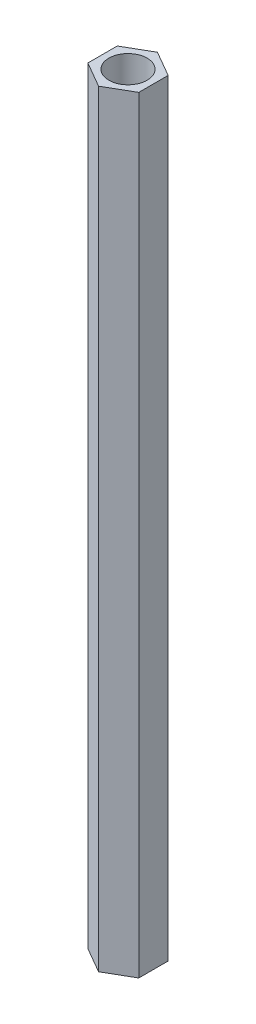
ISO-10303-21;
HEADER;
FILE_DESCRIPTION(('STEP AP214'),'2;1');
FILE_NAME('part.step','',(''),(''),'','','');
FILE_SCHEMA(('AUTOMOTIVE_DESIGN { 1 0 10303 214 1 1 1 1 }'));
ENDSEC;
DATA;
#1=APPLICATION_CONTEXT('core data for automotive mechanical design processes');
#2=APPLICATION_PROTOCOL_DEFINITION('international standard','automotive_design',2000,#1);
#3=PRODUCT_CONTEXT('',#1,'mechanical');
#4=PRODUCT('Part','Part','',(#3));
#5=PRODUCT_RELATED_PRODUCT_CATEGORY('part','',(#4));
#6=PRODUCT_DEFINITION_FORMATION('','',#4);
#7=PRODUCT_DEFINITION_CONTEXT('part definition',#1,'design');
#8=PRODUCT_DEFINITION('design','',#6,#7);
#9=PRODUCT_DEFINITION_SHAPE('','',#8);
#10=(LENGTH_UNIT() NAMED_UNIT(*) SI_UNIT(.MILLI.,.METRE.));
#11=(NAMED_UNIT(*) PLANE_ANGLE_UNIT() SI_UNIT($,.RADIAN.));
#12=(NAMED_UNIT(*) SI_UNIT($,.STERADIAN.) SOLID_ANGLE_UNIT());
#13=UNCERTAINTY_MEASURE_WITH_UNIT(LENGTH_MEASURE(1.E-05),#10,'distance_accuracy_value','');
#14=(GEOMETRIC_REPRESENTATION_CONTEXT(3) GLOBAL_UNCERTAINTY_ASSIGNED_CONTEXT((#13)) GLOBAL_UNIT_ASSIGNED_CONTEXT((#10,
#11,#12)) REPRESENTATION_CONTEXT('',''));
#15=CARTESIAN_POINT('',(0.,0.,0.));
#16=DIRECTION('',(0.,0.,1.));
#17=DIRECTION('',(1.,0.,0.));
#18=AXIS2_PLACEMENT_3D('',#15,#16,#17);
#19=CARTESIAN_POINT('',(0.,60.,0.));
#20=DIRECTION('',(0.,1.,0.));
#21=DIRECTION('',(0.,0.,1.));
#22=AXIS2_PLACEMENT_3D('',#19,#20,#21);
#23=PLANE('',#22);
#24=DIRECTION('',(-0.866025403784439,0.,-0.5));
#25=VECTOR('',#24,1.);
#26=CARTESIAN_POINT('',(1.99185842870421,60.,-1.15));
#27=LINE('',#26,#25);
#28=CARTESIAN_POINT('',(1.99185842870421,60.,-1.15));
#29=VERTEX_POINT('',#28);
#30=CARTESIAN_POINT('',(0.,60.,-2.3));
#31=VERTEX_POINT('',#30);
#32=EDGE_CURVE('E137',#29,#31,#27,.T.);
#33=ORIENTED_EDGE('',*,*,#32,.T.);
#34=DIRECTION('',(-0.866025403784439,0.,0.5));
#35=VECTOR('',#34,1.);
#36=CARTESIAN_POINT('',(0.,60.,-2.3));
#37=LINE('',#36,#35);
#38=CARTESIAN_POINT('',(-1.99185842870421,60.,-1.15));
#39=VERTEX_POINT('',#38);
#40=EDGE_CURVE('E95',#31,#39,#37,.T.);
#41=ORIENTED_EDGE('',*,*,#40,.T.);
#42=DIRECTION('',(0.,0.,1.));
#43=VECTOR('',#42,1.);
#44=CARTESIAN_POINT('',(-1.99185842870421,60.,-1.15));
#45=LINE('',#44,#43);
#46=CARTESIAN_POINT('',(-1.99185842870421,60.,1.15));
#47=VERTEX_POINT('',#46);
#48=EDGE_CURVE('E108',#39,#47,#45,.T.);
#49=ORIENTED_EDGE('',*,*,#48,.T.);
#50=DIRECTION('',(0.866025403784439,0.,0.5));
#51=VECTOR('',#50,1.);
#52=CARTESIAN_POINT('',(-1.99185842870421,60.,1.15));
#53=LINE('',#52,#51);
#54=CARTESIAN_POINT('',(0.,60.,2.3));
#55=VERTEX_POINT('',#54);
#56=EDGE_CURVE('E102',#47,#55,#53,.T.);
#57=ORIENTED_EDGE('',*,*,#56,.T.);
#58=DIRECTION('',(0.866025403784439,0.,-0.5));
#59=VECTOR('',#58,1.);
#60=CARTESIAN_POINT('',(0.,60.,2.3));
#61=LINE('',#60,#59);
#62=CARTESIAN_POINT('',(1.99185842870421,60.,1.15));
#63=VERTEX_POINT('',#62);
#64=EDGE_CURVE('E106',#55,#63,#61,.T.);
#65=ORIENTED_EDGE('',*,*,#64,.T.);
#66=DIRECTION('',(0.,0.,-1.));
#67=VECTOR('',#66,1.);
#68=CARTESIAN_POINT('',(1.99185842870421,60.,1.15));
#69=LINE('',#68,#67);
#70=EDGE_CURVE('E58',#63,#29,#69,.T.);
#71=ORIENTED_EDGE('',*,*,#70,.T.);
#72=EDGE_LOOP('',(#33,#41,#49,#57,#65,#71));
#73=FACE_BOUND('',#72,.T.);
#74=CARTESIAN_POINT('',(0.,60.,0.));
#75=DIRECTION('',(0.,1.,0.));
#76=DIRECTION('',(0.,0.,1.));
#77=AXIS2_PLACEMENT_3D('',#74,#75,#76);
#78=CIRCLE('',#77,1.5);
#79=CARTESIAN_POINT('',(0.,60.,1.5));
#80=VERTEX_POINT('',#79);
#81=EDGE_CURVE('E130',#80,#80,#78,.T.);
#82=ORIENTED_EDGE('',*,*,#81,.F.);
#83=EDGE_LOOP('',(#82));
#84=FACE_BOUND('',#83,.T.);
#85=ADVANCED_FACE('F41',(#73,#84),#23,.T.);
#86=CARTESIAN_POINT('',(0.,0.,0.));
#87=DIRECTION('',(0.,1.,0.));
#88=DIRECTION('',(0.,0.,1.));
#89=AXIS2_PLACEMENT_3D('',#86,#87,#88);
#90=PLANE('',#89);
#91=DIRECTION('',(-0.866025403784439,0.,-0.5));
#92=VECTOR('',#91,1.);
#93=CARTESIAN_POINT('',(1.99185842870421,0.,-1.15));
#94=LINE('',#93,#92);
#95=CARTESIAN_POINT('',(1.99185842870421,0.,-1.15));
#96=VERTEX_POINT('',#95);
#97=CARTESIAN_POINT('',(0.,0.,-2.3));
#98=VERTEX_POINT('',#97);
#99=EDGE_CURVE('E126',#96,#98,#94,.T.);
#100=ORIENTED_EDGE('',*,*,#99,.F.);
#101=DIRECTION('',(0.,0.,-1.));
#102=VECTOR('',#101,1.);
#103=CARTESIAN_POINT('',(1.99185842870421,0.,1.15));
#104=LINE('',#103,#102);
#105=CARTESIAN_POINT('',(1.99185842870421,0.,1.15));
#106=VERTEX_POINT('',#105);
#107=EDGE_CURVE('E87',#106,#96,#104,.T.);
#108=ORIENTED_EDGE('',*,*,#107,.F.);
#109=DIRECTION('',(0.866025403784439,0.,-0.5));
#110=VECTOR('',#109,1.);
#111=CARTESIAN_POINT('',(0.,0.,2.3));
#112=LINE('',#111,#110);
#113=CARTESIAN_POINT('',(0.,0.,2.3));
#114=VERTEX_POINT('',#113);
#115=EDGE_CURVE('E81',#114,#106,#112,.T.);
#116=ORIENTED_EDGE('',*,*,#115,.F.);
#117=DIRECTION('',(0.866025403784439,0.,0.5));
#118=VECTOR('',#117,1.);
#119=CARTESIAN_POINT('',(-1.99185842870421,0.,1.15));
#120=LINE('',#119,#118);
#121=CARTESIAN_POINT('',(-1.99185842870421,0.,1.15));
#122=VERTEX_POINT('',#121);
#123=EDGE_CURVE('E116',#122,#114,#120,.T.);
#124=ORIENTED_EDGE('',*,*,#123,.F.);
#125=DIRECTION('',(0.,0.,1.));
#126=VECTOR('',#125,1.);
#127=CARTESIAN_POINT('',(-1.99185842870421,0.,-1.15));
#128=LINE('',#127,#126);
#129=CARTESIAN_POINT('',(-1.99185842870421,0.,-1.15));
#130=VERTEX_POINT('',#129);
#131=EDGE_CURVE('E132',#130,#122,#128,.T.);
#132=ORIENTED_EDGE('',*,*,#131,.F.);
#133=DIRECTION('',(-0.866025403784439,0.,0.5));
#134=VECTOR('',#133,1.);
#135=CARTESIAN_POINT('',(0.,0.,-2.3));
#136=LINE('',#135,#134);
#137=EDGE_CURVE('E129',#98,#130,#136,.T.);
#138=ORIENTED_EDGE('',*,*,#137,.F.);
#139=EDGE_LOOP('',(#100,#108,#116,#124,#132,#138));
#140=FACE_BOUND('',#139,.T.);
#141=CARTESIAN_POINT('',(0.,0.,0.));
#142=DIRECTION('',(0.,1.,0.));
#143=DIRECTION('',(0.,0.,1.));
#144=AXIS2_PLACEMENT_3D('',#141,#142,#143);
#145=CIRCLE('',#144,1.5);
#146=CARTESIAN_POINT('',(0.,0.,1.5));
#147=VERTEX_POINT('',#146);
#148=EDGE_CURVE('E230',#147,#147,#145,.T.);
#149=ORIENTED_EDGE('',*,*,#148,.T.);
#150=EDGE_LOOP('',(#149));
#151=FACE_BOUND('',#150,.T.);
#152=ADVANCED_FACE('F146',(#140,#151),#90,.F.);
#153=CARTESIAN_POINT('',(1.99185842870421,60.,-1.15));
#154=DIRECTION('',(-0.5,0.,0.866025403784439));
#155=DIRECTION('',(0.866025403784439,0.,0.5));
#156=AXIS2_PLACEMENT_3D('',#153,#154,#155);
#157=PLANE('',#156);
#158=ORIENTED_EDGE('',*,*,#99,.T.);
#159=DIRECTION('',(0.,-1.,0.));
#160=VECTOR('',#159,1.);
#161=CARTESIAN_POINT('',(0.,60.,-2.3));
#162=LINE('',#161,#160);
#163=EDGE_CURVE('E11',#31,#98,#162,.T.);
#164=ORIENTED_EDGE('',*,*,#163,.F.);
#165=ORIENTED_EDGE('',*,*,#32,.F.);
#166=DIRECTION('',(0.,-1.,0.));
#167=VECTOR('',#166,1.);
#168=CARTESIAN_POINT('',(1.99185842870421,60.,-1.15));
#169=LINE('',#168,#167);
#170=EDGE_CURVE('E122',#29,#96,#169,.T.);
#171=ORIENTED_EDGE('',*,*,#170,.T.);
#172=EDGE_LOOP('',(#158,#164,#165,#171));
#173=FACE_BOUND('',#172,.T.);
#174=ADVANCED_FACE('F43',(#173),#157,.F.);
#175=CARTESIAN_POINT('',(0.,60.,-2.3));
#176=DIRECTION('',(0.5,0.,0.866025403784439));
#177=DIRECTION('',(0.866025403784439,0.,-0.5));
#178=AXIS2_PLACEMENT_3D('',#175,#176,#177);
#179=PLANE('',#178);
#180=ORIENTED_EDGE('',*,*,#137,.T.);
#181=DIRECTION('',(0.,-1.,0.));
#182=VECTOR('',#181,1.);
#183=CARTESIAN_POINT('',(-1.99185842870421,60.,-1.15));
#184=LINE('',#183,#182);
#185=EDGE_CURVE('E50',#39,#130,#184,.T.);
#186=ORIENTED_EDGE('',*,*,#185,.F.);
#187=ORIENTED_EDGE('',*,*,#40,.F.);
#188=ORIENTED_EDGE('',*,*,#163,.T.);
#189=EDGE_LOOP('',(#180,#186,#187,#188));
#190=FACE_BOUND('',#189,.T.);
#191=ADVANCED_FACE('F171',(#190),#179,.F.);
#192=CARTESIAN_POINT('',(-1.99185842870421,60.,-1.15));
#193=DIRECTION('',(1.,0.,0.));
#194=DIRECTION('',(0.,0.,-1.));
#195=AXIS2_PLACEMENT_3D('',#192,#193,#194);
#196=PLANE('',#195);
#197=ORIENTED_EDGE('',*,*,#131,.T.);
#198=DIRECTION('',(0.,-1.,0.));
#199=VECTOR('',#198,1.);
#200=CARTESIAN_POINT('',(-1.99185842870421,60.,1.15));
#201=LINE('',#200,#199);
#202=EDGE_CURVE('E117',#47,#122,#201,.T.);
#203=ORIENTED_EDGE('',*,*,#202,.F.);
#204=ORIENTED_EDGE('',*,*,#48,.F.);
#205=ORIENTED_EDGE('',*,*,#185,.T.);
#206=EDGE_LOOP('',(#197,#203,#204,#205));
#207=FACE_BOUND('',#206,.T.);
#208=ADVANCED_FACE('F143',(#207),#196,.F.);
#209=CARTESIAN_POINT('',(-1.99185842870421,60.,1.15));
#210=DIRECTION('',(0.5,0.,-0.866025403784439));
#211=DIRECTION('',(-0.866025403784439,0.,-0.5));
#212=AXIS2_PLACEMENT_3D('',#209,#210,#211);
#213=PLANE('',#212);
#214=ORIENTED_EDGE('',*,*,#123,.T.);
#215=DIRECTION('',(0.,-1.,0.));
#216=VECTOR('',#215,1.);
#217=CARTESIAN_POINT('',(0.,60.,2.3));
#218=LINE('',#217,#216);
#219=EDGE_CURVE('E113',#55,#114,#218,.T.);
#220=ORIENTED_EDGE('',*,*,#219,.F.);
#221=ORIENTED_EDGE('',*,*,#56,.F.);
#222=ORIENTED_EDGE('',*,*,#202,.T.);
#223=EDGE_LOOP('',(#214,#220,#221,#222));
#224=FACE_BOUND('',#223,.T.);
#225=ADVANCED_FACE('F114',(#224),#213,.F.);
#226=CARTESIAN_POINT('',(0.,60.,2.3));
#227=DIRECTION('',(-0.5,0.,-0.866025403784439));
#228=DIRECTION('',(-0.866025403784439,0.,0.5));
#229=AXIS2_PLACEMENT_3D('',#226,#227,#228);
#230=PLANE('',#229);
#231=ORIENTED_EDGE('',*,*,#115,.T.);
#232=DIRECTION('',(0.,-1.,0.));
#233=VECTOR('',#232,1.);
#234=CARTESIAN_POINT('',(1.99185842870421,60.,1.15));
#235=LINE('',#234,#233);
#236=EDGE_CURVE('E118',#63,#106,#235,.T.);
#237=ORIENTED_EDGE('',*,*,#236,.F.);
#238=ORIENTED_EDGE('',*,*,#64,.F.);
#239=ORIENTED_EDGE('',*,*,#219,.T.);
#240=EDGE_LOOP('',(#231,#237,#238,#239));
#241=FACE_BOUND('',#240,.T.);
#242=ADVANCED_FACE('F120',(#241),#230,.F.);
#243=CARTESIAN_POINT('',(1.99185842870421,60.,1.15));
#244=DIRECTION('',(-1.,0.,0.));
#245=DIRECTION('',(0.,0.,1.));
#246=AXIS2_PLACEMENT_3D('',#243,#244,#245);
#247=PLANE('',#246);
#248=ORIENTED_EDGE('',*,*,#107,.T.);
#249=ORIENTED_EDGE('',*,*,#170,.F.);
#250=ORIENTED_EDGE('',*,*,#70,.F.);
#251=ORIENTED_EDGE('',*,*,#236,.T.);
#252=EDGE_LOOP('',(#248,#249,#250,#251));
#253=FACE_BOUND('',#252,.T.);
#254=ADVANCED_FACE('F151',(#253),#247,.F.);
#255=CARTESIAN_POINT('',(0.,60.,0.));
#256=DIRECTION('',(0.,-1.,0.));
#257=DIRECTION('',(0.,0.,-1.));
#258=AXIS2_PLACEMENT_3D('',#255,#256,#257);
#259=CYLINDRICAL_SURFACE('',#258,1.5);
#260=ORIENTED_EDGE('',*,*,#81,.T.);
#261=EDGE_LOOP('',(#260));
#262=FACE_BOUND('',#261,.T.);
#263=ORIENTED_EDGE('',*,*,#148,.F.);
#264=EDGE_LOOP('',(#263));
#265=FACE_BOUND('',#264,.T.);
#266=ADVANCED_FACE('F153',(#262,#265),#259,.F.);
#267=CLOSED_SHELL('',(#85,#152,#174,#191,#208,#225,#242,#254,#266));
#268=MANIFOLD_SOLID_BREP('B2',#267);
#269=ADVANCED_BREP_SHAPE_REPRESENTATION('',(#18,#268),#14);
#270=SHAPE_DEFINITION_REPRESENTATION(#9,#269);
ENDSEC;
END-ISO-10303-21;
